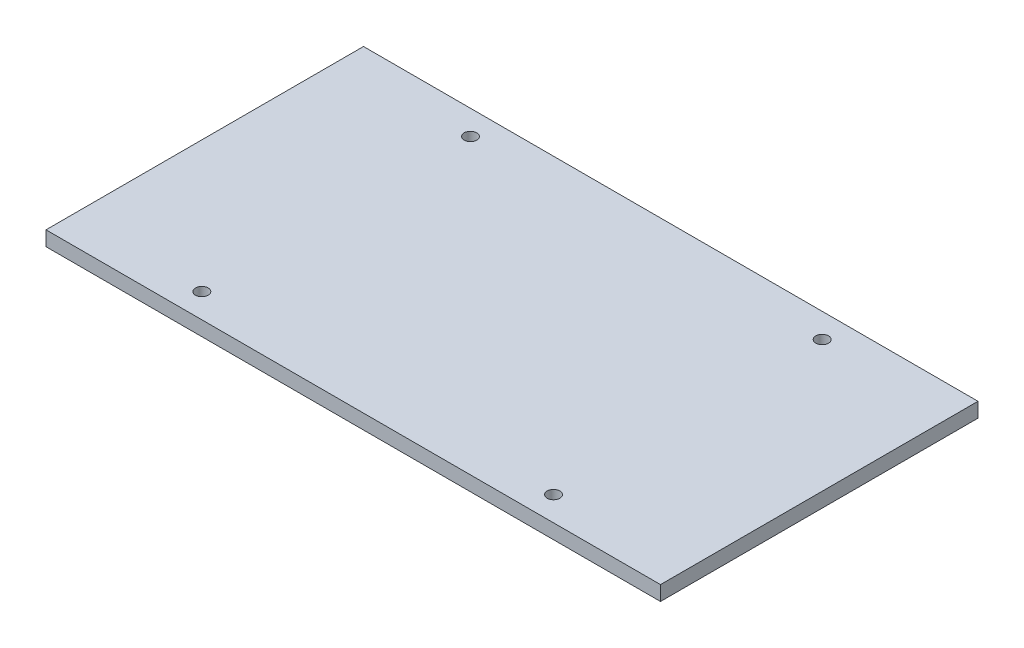
ISO-10303-21;
HEADER;
FILE_DESCRIPTION(('STEP AP214'),'2;1');
FILE_NAME('part.step','',(''),(''),'','','');
FILE_SCHEMA(('AUTOMOTIVE_DESIGN { 1 0 10303 214 1 1 1 1 }'));
ENDSEC;
DATA;
#1=APPLICATION_CONTEXT('core data for automotive mechanical design processes');
#2=APPLICATION_PROTOCOL_DEFINITION('international standard','automotive_design',2000,#1);
#3=PRODUCT_CONTEXT('',#1,'mechanical');
#4=PRODUCT('Part','Part','',(#3));
#5=PRODUCT_RELATED_PRODUCT_CATEGORY('part','',(#4));
#6=PRODUCT_DEFINITION_FORMATION('','',#4);
#7=PRODUCT_DEFINITION_CONTEXT('part definition',#1,'design');
#8=PRODUCT_DEFINITION('design','',#6,#7);
#9=PRODUCT_DEFINITION_SHAPE('','',#8);
#10=(LENGTH_UNIT() NAMED_UNIT(*) SI_UNIT(.MILLI.,.METRE.));
#11=(NAMED_UNIT(*) PLANE_ANGLE_UNIT() SI_UNIT($,.RADIAN.));
#12=(NAMED_UNIT(*) SI_UNIT($,.STERADIAN.) SOLID_ANGLE_UNIT());
#13=UNCERTAINTY_MEASURE_WITH_UNIT(LENGTH_MEASURE(1.E-05),#10,'distance_accuracy_value','');
#14=(GEOMETRIC_REPRESENTATION_CONTEXT(3) GLOBAL_UNCERTAINTY_ASSIGNED_CONTEXT((#13)) GLOBAL_UNIT_ASSIGNED_CONTEXT((#10,
#11,#12)) REPRESENTATION_CONTEXT('',''));
#15=CARTESIAN_POINT('',(0.,0.,0.));
#16=DIRECTION('',(0.,0.,1.));
#17=DIRECTION('',(1.,0.,0.));
#18=AXIS2_PLACEMENT_3D('',#15,#16,#17);
#19=CARTESIAN_POINT('',(0.,3.,0.));
#20=DIRECTION('',(0.,-1.,0.));
#21=DIRECTION('',(0.,0.,-1.));
#22=AXIS2_PLACEMENT_3D('',#19,#20,#21);
#23=PLANE('',#22);
#24=DIRECTION('',(0.,0.,1.));
#25=VECTOR('',#24,1.);
#26=CARTESIAN_POINT('',(0.,3.,0.));
#27=LINE('',#26,#25);
#28=CARTESIAN_POINT('',(0.,3.,-65.));
#29=VERTEX_POINT('',#28);
#30=CARTESIAN_POINT('',(0.,3.,0.));
#31=VERTEX_POINT('',#30);
#32=EDGE_CURVE('E91',#29,#31,#27,.T.);
#33=ORIENTED_EDGE('',*,*,#32,.T.);
#34=DIRECTION('',(1.,0.,0.));
#35=VECTOR('',#34,1.);
#36=CARTESIAN_POINT('',(0.,3.,0.));
#37=LINE('',#36,#35);
#38=CARTESIAN_POINT('',(125.8,3.,0.));
#39=VERTEX_POINT('',#38);
#40=EDGE_CURVE('E86',#31,#39,#37,.T.);
#41=ORIENTED_EDGE('',*,*,#40,.T.);
#42=DIRECTION('',(0.,0.,-1.));
#43=VECTOR('',#42,1.);
#44=CARTESIAN_POINT('',(125.8,3.,0.));
#45=LINE('',#44,#43);
#46=CARTESIAN_POINT('',(125.8,3.,-65.));
#47=VERTEX_POINT('',#46);
#48=EDGE_CURVE('E89',#39,#47,#45,.T.);
#49=ORIENTED_EDGE('',*,*,#48,.T.);
#50=DIRECTION('',(-1.,0.,0.));
#51=VECTOR('',#50,1.);
#52=CARTESIAN_POINT('',(0.,3.,-65.));
#53=LINE('',#52,#51);
#54=EDGE_CURVE('E56',#47,#29,#53,.T.);
#55=ORIENTED_EDGE('',*,*,#54,.T.);
#56=EDGE_LOOP('',(#33,#41,#49,#55));
#57=FACE_BOUND('',#56,.T.);
#58=CARTESIAN_POINT('',(26.9,3.,-60.));
#59=DIRECTION('',(0.,1.,0.));
#60=DIRECTION('',(0.,0.,1.));
#61=AXIS2_PLACEMENT_3D('',#58,#59,#60);
#62=CIRCLE('',#61,1.30000000000001);
#63=CARTESIAN_POINT('',(26.9,3.,-58.7));
#64=VERTEX_POINT('',#63);
#65=EDGE_CURVE('E106',#64,#64,#62,.T.);
#66=ORIENTED_EDGE('',*,*,#65,.F.);
#67=EDGE_LOOP('',(#66));
#68=FACE_BOUND('',#67,.T.);
#69=CARTESIAN_POINT('',(98.9,3.,-60.));
#70=DIRECTION('',(0.,1.,0.));
#71=DIRECTION('',(0.,0.,1.));
#72=AXIS2_PLACEMENT_3D('',#69,#70,#71);
#73=CIRCLE('',#72,1.30000000000001);
#74=CARTESIAN_POINT('',(98.9,3.,-58.7));
#75=VERTEX_POINT('',#74);
#76=EDGE_CURVE('E121',#75,#75,#73,.T.);
#77=ORIENTED_EDGE('',*,*,#76,.F.);
#78=EDGE_LOOP('',(#77));
#79=FACE_BOUND('',#78,.T.);
#80=CARTESIAN_POINT('',(98.9,3.,-5.));
#81=DIRECTION('',(0.,1.,0.));
#82=DIRECTION('',(0.,0.,1.));
#83=AXIS2_PLACEMENT_3D('',#80,#81,#82);
#84=CIRCLE('',#83,1.30000000000001);
#85=CARTESIAN_POINT('',(98.9,3.,-3.69999999999999));
#86=VERTEX_POINT('',#85);
#87=EDGE_CURVE('E127',#86,#86,#84,.T.);
#88=ORIENTED_EDGE('',*,*,#87,.F.);
#89=EDGE_LOOP('',(#88));
#90=FACE_BOUND('',#89,.T.);
#91=CARTESIAN_POINT('',(26.9,3.,-5.));
#92=DIRECTION('',(0.,1.,0.));
#93=DIRECTION('',(0.,0.,1.));
#94=AXIS2_PLACEMENT_3D('',#91,#92,#93);
#95=CIRCLE('',#94,1.30000000000001);
#96=CARTESIAN_POINT('',(26.9,3.,-3.69999999999999));
#97=VERTEX_POINT('',#96);
#98=EDGE_CURVE('E133',#97,#97,#95,.T.);
#99=ORIENTED_EDGE('',*,*,#98,.F.);
#100=EDGE_LOOP('',(#99));
#101=FACE_BOUND('',#100,.T.);
#102=ADVANCED_FACE('F39',(#57,#68,#79,#90,#101),#23,.F.);
#103=CARTESIAN_POINT('',(0.,0.,0.));
#104=DIRECTION('',(0.,-1.,0.));
#105=DIRECTION('',(0.,0.,-1.));
#106=AXIS2_PLACEMENT_3D('',#103,#104,#105);
#107=PLANE('',#106);
#108=CARTESIAN_POINT('',(98.9,0.,-5.));
#109=DIRECTION('',(0.,1.,0.));
#110=DIRECTION('',(0.,0.,1.));
#111=AXIS2_PLACEMENT_3D('',#108,#109,#110);
#112=CIRCLE('',#111,1.30000000000001);
#113=CARTESIAN_POINT('',(98.9,0.,-3.69999999999999));
#114=VERTEX_POINT('',#113);
#115=EDGE_CURVE('E130',#114,#114,#112,.T.);
#116=ORIENTED_EDGE('',*,*,#115,.T.);
#117=EDGE_LOOP('',(#116));
#118=FACE_BOUND('',#117,.T.);
#119=CARTESIAN_POINT('',(26.9,0.,-60.));
#120=DIRECTION('',(0.,1.,0.));
#121=DIRECTION('',(0.,0.,1.));
#122=AXIS2_PLACEMENT_3D('',#119,#120,#121);
#123=CIRCLE('',#122,1.30000000000001);
#124=CARTESIAN_POINT('',(26.9,0.,-58.7));
#125=VERTEX_POINT('',#124);
#126=EDGE_CURVE('E118',#125,#125,#123,.T.);
#127=ORIENTED_EDGE('',*,*,#126,.T.);
#128=EDGE_LOOP('',(#127));
#129=FACE_BOUND('',#128,.T.);
#130=DIRECTION('',(0.,0.,1.));
#131=VECTOR('',#130,1.);
#132=CARTESIAN_POINT('',(0.,0.,0.));
#133=LINE('',#132,#131);
#134=CARTESIAN_POINT('',(0.,0.,-65.));
#135=VERTEX_POINT('',#134);
#136=CARTESIAN_POINT('',(0.,0.,0.));
#137=VERTEX_POINT('',#136);
#138=EDGE_CURVE('E103',#135,#137,#133,.T.);
#139=ORIENTED_EDGE('',*,*,#138,.F.);
#140=DIRECTION('',(-1.,0.,0.));
#141=VECTOR('',#140,1.);
#142=CARTESIAN_POINT('',(0.,0.,-65.));
#143=LINE('',#142,#141);
#144=CARTESIAN_POINT('',(125.8,0.,-65.));
#145=VERTEX_POINT('',#144);
#146=EDGE_CURVE('E79',#145,#135,#143,.T.);
#147=ORIENTED_EDGE('',*,*,#146,.F.);
#148=DIRECTION('',(0.,0.,-1.));
#149=VECTOR('',#148,1.);
#150=CARTESIAN_POINT('',(125.8,0.,0.));
#151=LINE('',#150,#149);
#152=CARTESIAN_POINT('',(125.8,0.,0.));
#153=VERTEX_POINT('',#152);
#154=EDGE_CURVE('E73',#153,#145,#151,.T.);
#155=ORIENTED_EDGE('',*,*,#154,.F.);
#156=DIRECTION('',(1.,0.,0.));
#157=VECTOR('',#156,1.);
#158=CARTESIAN_POINT('',(0.,0.,0.));
#159=LINE('',#158,#157);
#160=EDGE_CURVE('E95',#137,#153,#159,.T.);
#161=ORIENTED_EDGE('',*,*,#160,.F.);
#162=EDGE_LOOP('',(#139,#147,#155,#161));
#163=FACE_BOUND('',#162,.T.);
#164=CARTESIAN_POINT('',(98.9,0.,-60.));
#165=DIRECTION('',(0.,1.,0.));
#166=DIRECTION('',(0.,0.,1.));
#167=AXIS2_PLACEMENT_3D('',#164,#165,#166);
#168=CIRCLE('',#167,1.30000000000001);
#169=CARTESIAN_POINT('',(98.9,0.,-58.7));
#170=VERTEX_POINT('',#169);
#171=EDGE_CURVE('E124',#170,#170,#168,.T.);
#172=ORIENTED_EDGE('',*,*,#171,.T.);
#173=EDGE_LOOP('',(#172));
#174=FACE_BOUND('',#173,.T.);
#175=CARTESIAN_POINT('',(26.9,0.,-5.));
#176=DIRECTION('',(0.,1.,0.));
#177=DIRECTION('',(0.,0.,1.));
#178=AXIS2_PLACEMENT_3D('',#175,#176,#177);
#179=CIRCLE('',#178,1.30000000000001);
#180=CARTESIAN_POINT('',(26.9,0.,-3.69999999999999));
#181=VERTEX_POINT('',#180);
#182=EDGE_CURVE('E136',#181,#181,#179,.T.);
#183=ORIENTED_EDGE('',*,*,#182,.T.);
#184=EDGE_LOOP('',(#183));
#185=FACE_BOUND('',#184,.T.);
#186=ADVANCED_FACE('F114',(#118,#129,#163,#174,#185),#107,.T.);
#187=CARTESIAN_POINT('',(0.,3.,0.));
#188=DIRECTION('',(1.,0.,0.));
#189=DIRECTION('',(0.,0.,-1.));
#190=AXIS2_PLACEMENT_3D('',#187,#188,#189);
#191=PLANE('',#190);
#192=ORIENTED_EDGE('',*,*,#138,.T.);
#193=DIRECTION('',(0.,-1.,0.));
#194=VECTOR('',#193,1.);
#195=CARTESIAN_POINT('',(0.,3.,0.));
#196=LINE('',#195,#194);
#197=EDGE_CURVE('E11',#31,#137,#196,.T.);
#198=ORIENTED_EDGE('',*,*,#197,.F.);
#199=ORIENTED_EDGE('',*,*,#32,.F.);
#200=DIRECTION('',(0.,-1.,0.));
#201=VECTOR('',#200,1.);
#202=CARTESIAN_POINT('',(0.,3.,-65.));
#203=LINE('',#202,#201);
#204=EDGE_CURVE('E99',#29,#135,#203,.T.);
#205=ORIENTED_EDGE('',*,*,#204,.T.);
#206=EDGE_LOOP('',(#192,#198,#199,#205));
#207=FACE_BOUND('',#206,.T.);
#208=ADVANCED_FACE('F41',(#207),#191,.F.);
#209=CARTESIAN_POINT('',(0.,3.,0.));
#210=DIRECTION('',(0.,0.,-1.));
#211=DIRECTION('',(-1.,0.,0.));
#212=AXIS2_PLACEMENT_3D('',#209,#210,#211);
#213=PLANE('',#212);
#214=ORIENTED_EDGE('',*,*,#160,.T.);
#215=DIRECTION('',(0.,-1.,0.));
#216=VECTOR('',#215,1.);
#217=CARTESIAN_POINT('',(125.8,3.,0.));
#218=LINE('',#217,#216);
#219=EDGE_CURVE('E48',#39,#153,#218,.T.);
#220=ORIENTED_EDGE('',*,*,#219,.F.);
#221=ORIENTED_EDGE('',*,*,#40,.F.);
#222=ORIENTED_EDGE('',*,*,#197,.T.);
#223=EDGE_LOOP('',(#214,#220,#221,#222));
#224=FACE_BOUND('',#223,.T.);
#225=ADVANCED_FACE('F94',(#224),#213,.F.);
#226=CARTESIAN_POINT('',(125.8,3.,0.));
#227=DIRECTION('',(-1.,0.,0.));
#228=DIRECTION('',(0.,0.,1.));
#229=AXIS2_PLACEMENT_3D('',#226,#227,#228);
#230=PLANE('',#229);
#231=ORIENTED_EDGE('',*,*,#154,.T.);
#232=DIRECTION('',(0.,-1.,0.));
#233=VECTOR('',#232,1.);
#234=CARTESIAN_POINT('',(125.8,3.,-65.));
#235=LINE('',#234,#233);
#236=EDGE_CURVE('E96',#47,#145,#235,.T.);
#237=ORIENTED_EDGE('',*,*,#236,.F.);
#238=ORIENTED_EDGE('',*,*,#48,.F.);
#239=ORIENTED_EDGE('',*,*,#219,.T.);
#240=EDGE_LOOP('',(#231,#237,#238,#239));
#241=FACE_BOUND('',#240,.T.);
#242=ADVANCED_FACE('F97',(#241),#230,.F.);
#243=CARTESIAN_POINT('',(0.,3.,-65.));
#244=DIRECTION('',(0.,0.,1.));
#245=DIRECTION('',(1.,0.,0.));
#246=AXIS2_PLACEMENT_3D('',#243,#244,#245);
#247=PLANE('',#246);
#248=ORIENTED_EDGE('',*,*,#146,.T.);
#249=ORIENTED_EDGE('',*,*,#204,.F.);
#250=ORIENTED_EDGE('',*,*,#54,.F.);
#251=ORIENTED_EDGE('',*,*,#236,.T.);
#252=EDGE_LOOP('',(#248,#249,#250,#251));
#253=FACE_BOUND('',#252,.T.);
#254=ADVANCED_FACE('F111',(#253),#247,.F.);
#255=CARTESIAN_POINT('',(26.9,3.,-60.));
#256=DIRECTION('',(0.,-1.,0.));
#257=DIRECTION('',(0.,0.,-1.));
#258=AXIS2_PLACEMENT_3D('',#255,#256,#257);
#259=CYLINDRICAL_SURFACE('',#258,1.30000000000001);
#260=ORIENTED_EDGE('',*,*,#65,.T.);
#261=EDGE_LOOP('',(#260));
#262=FACE_BOUND('',#261,.T.);
#263=ORIENTED_EDGE('',*,*,#126,.F.);
#264=EDGE_LOOP('',(#263));
#265=FACE_BOUND('',#264,.T.);
#266=ADVANCED_FACE('F153',(#262,#265),#259,.F.);
#267=CARTESIAN_POINT('',(98.9,3.,-60.));
#268=DIRECTION('',(0.,-1.,0.));
#269=DIRECTION('',(0.,0.,-1.));
#270=AXIS2_PLACEMENT_3D('',#267,#268,#269);
#271=CYLINDRICAL_SURFACE('',#270,1.30000000000001);
#272=ORIENTED_EDGE('',*,*,#76,.T.);
#273=EDGE_LOOP('',(#272));
#274=FACE_BOUND('',#273,.T.);
#275=ORIENTED_EDGE('',*,*,#171,.F.);
#276=EDGE_LOOP('',(#275));
#277=FACE_BOUND('',#276,.T.);
#278=ADVANCED_FACE('F205',(#274,#277),#271,.F.);
#279=CARTESIAN_POINT('',(98.9,3.,-5.));
#280=DIRECTION('',(0.,-1.,0.));
#281=DIRECTION('',(0.,0.,-1.));
#282=AXIS2_PLACEMENT_3D('',#279,#280,#281);
#283=CYLINDRICAL_SURFACE('',#282,1.30000000000001);
#284=ORIENTED_EDGE('',*,*,#87,.T.);
#285=EDGE_LOOP('',(#284));
#286=FACE_BOUND('',#285,.T.);
#287=ORIENTED_EDGE('',*,*,#115,.F.);
#288=EDGE_LOOP('',(#287));
#289=FACE_BOUND('',#288,.T.);
#290=ADVANCED_FACE('F214',(#286,#289),#283,.F.);
#291=CARTESIAN_POINT('',(26.9,3.,-5.));
#292=DIRECTION('',(0.,-1.,0.));
#293=DIRECTION('',(0.,0.,-1.));
#294=AXIS2_PLACEMENT_3D('',#291,#292,#293);
#295=CYLINDRICAL_SURFACE('',#294,1.30000000000001);
#296=ORIENTED_EDGE('',*,*,#98,.T.);
#297=EDGE_LOOP('',(#296));
#298=FACE_BOUND('',#297,.T.);
#299=ORIENTED_EDGE('',*,*,#182,.F.);
#300=EDGE_LOOP('',(#299));
#301=FACE_BOUND('',#300,.T.);
#302=ADVANCED_FACE('F142',(#298,#301),#295,.F.);
#303=CLOSED_SHELL('',(#102,#186,#208,#225,#242,#254,#266,#278,#290,#302));
#304=MANIFOLD_SOLID_BREP('B2',#303);
#305=ADVANCED_BREP_SHAPE_REPRESENTATION('',(#18,#304),#14);
#306=SHAPE_DEFINITION_REPRESENTATION(#9,#305);
ENDSEC;
END-ISO-10303-21;
